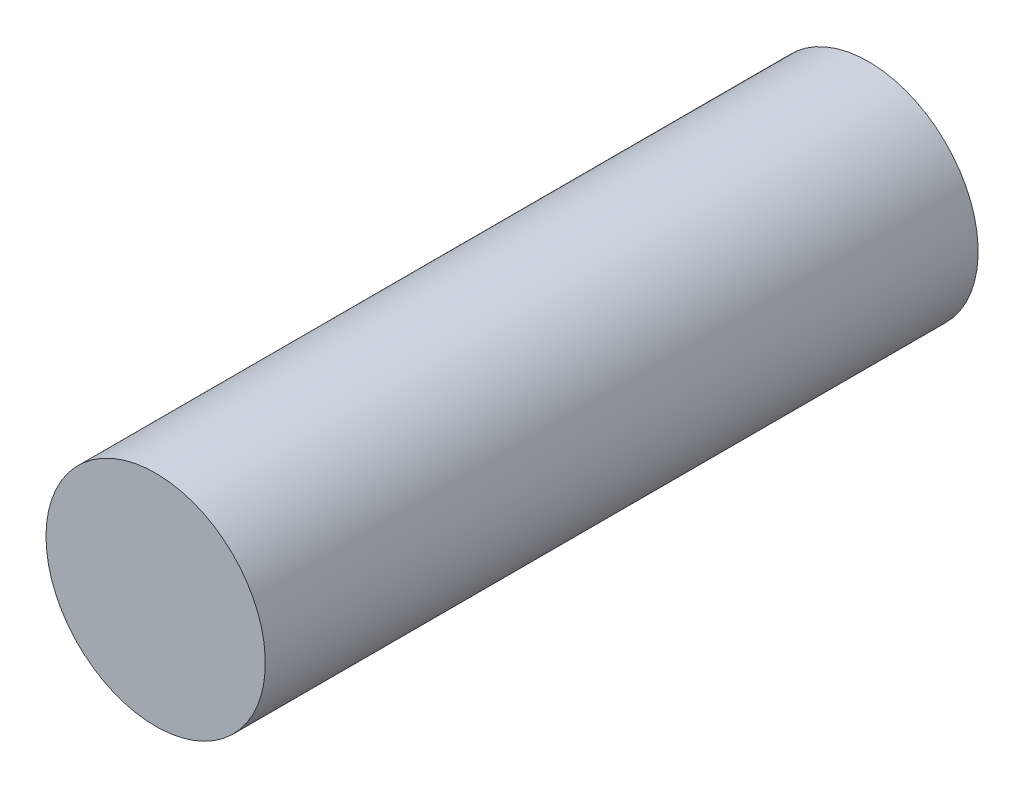
ISO-10303-21;
HEADER;
FILE_DESCRIPTION(('STEP AP214'),'2;1');
FILE_NAME('part.step','',(''),(''),'','','');
FILE_SCHEMA(('AUTOMOTIVE_DESIGN { 1 0 10303 214 1 1 1 1 }'));
ENDSEC;
DATA;
#1=APPLICATION_CONTEXT('core data for automotive mechanical design processes');
#2=APPLICATION_PROTOCOL_DEFINITION('international standard','automotive_design',2000,#1);
#3=PRODUCT_CONTEXT('',#1,'mechanical');
#4=PRODUCT('Part','Part','',(#3));
#5=PRODUCT_RELATED_PRODUCT_CATEGORY('part','',(#4));
#6=PRODUCT_DEFINITION_FORMATION('','',#4);
#7=PRODUCT_DEFINITION_CONTEXT('part definition',#1,'design');
#8=PRODUCT_DEFINITION('design','',#6,#7);
#9=PRODUCT_DEFINITION_SHAPE('','',#8);
#10=(LENGTH_UNIT() NAMED_UNIT(*) SI_UNIT(.MILLI.,.METRE.));
#11=(NAMED_UNIT(*) PLANE_ANGLE_UNIT() SI_UNIT($,.RADIAN.));
#12=(NAMED_UNIT(*) SI_UNIT($,.STERADIAN.) SOLID_ANGLE_UNIT());
#13=UNCERTAINTY_MEASURE_WITH_UNIT(LENGTH_MEASURE(1.E-05),#10,'distance_accuracy_value','');
#14=(GEOMETRIC_REPRESENTATION_CONTEXT(3) GLOBAL_UNCERTAINTY_ASSIGNED_CONTEXT((#13)) GLOBAL_UNIT_ASSIGNED_CONTEXT((#10,
#11,#12)) REPRESENTATION_CONTEXT('',''));
#15=CARTESIAN_POINT('',(0.,0.,0.));
#16=DIRECTION('',(0.,0.,1.));
#17=DIRECTION('',(1.,0.,0.));
#18=AXIS2_PLACEMENT_3D('',#15,#16,#17);
#19=CARTESIAN_POINT('',(0.,0.,13.));
#20=DIRECTION('',(0.,0.,-1.));
#21=DIRECTION('',(-1.,0.,0.));
#22=AXIS2_PLACEMENT_3D('',#19,#20,#21);
#23=CYLINDRICAL_SURFACE('',#22,2.);
#24=CARTESIAN_POINT('',(0.,0.,13.));
#25=DIRECTION('',(0.,0.,1.));
#26=DIRECTION('',(1.,0.,0.));
#27=AXIS2_PLACEMENT_3D('',#24,#25,#26);
#28=CIRCLE('',#27,2.);
#29=CARTESIAN_POINT('',(-2.,0.,13.));
#30=VERTEX_POINT('',#29);
#31=EDGE_CURVE('E10',#30,#30,#28,.T.);
#32=CARTESIAN_POINT('',(0.,0.,0.));
#33=DIRECTION('',(0.,0.,1.));
#34=DIRECTION('',(1.,0.,0.));
#35=AXIS2_PLACEMENT_3D('',#32,#33,#34);
#36=CIRCLE('',#35,2.);
#37=CARTESIAN_POINT('',(-2.,0.,0.));
#38=VERTEX_POINT('',#37);
#39=EDGE_CURVE('E33',#38,#38,#36,.T.);
#40=CARTESIAN_POINT('',(-2.,0.,13.));
#41=CARTESIAN_POINT('',(-2.,0.,12.8645833333333));
#42=CARTESIAN_POINT('',(-2.,0.,12.7291666666667));
#43=CARTESIAN_POINT('',(-2.,0.,12.4583333333333));
#44=CARTESIAN_POINT('',(-2.,0.,12.3229166666667));
#45=CARTESIAN_POINT('',(-2.,0.,12.0520833333333));
#46=CARTESIAN_POINT('',(-2.,0.,11.9166666666667));
#47=CARTESIAN_POINT('',(-2.,0.,11.6458333333333));
#48=CARTESIAN_POINT('',(-2.,0.,11.5104166666667));
#49=CARTESIAN_POINT('',(-2.,0.,11.2395833333333));
#50=CARTESIAN_POINT('',(-2.,0.,11.1041666666667));
#51=CARTESIAN_POINT('',(-2.,0.,10.8333333333333));
#52=CARTESIAN_POINT('',(-2.,0.,10.6979166666667));
#53=CARTESIAN_POINT('',(-2.,0.,10.4270833333333));
#54=CARTESIAN_POINT('',(-2.,0.,10.2916666666667));
#55=CARTESIAN_POINT('',(-2.,0.,10.0208333333333));
#56=CARTESIAN_POINT('',(-2.,0.,9.88541666666667));
#57=CARTESIAN_POINT('',(-2.,0.,9.61458333333333));
#58=CARTESIAN_POINT('',(-2.,0.,9.47916666666667));
#59=CARTESIAN_POINT('',(-2.,0.,9.20833333333333));
#60=CARTESIAN_POINT('',(-2.,0.,9.07291666666666));
#61=CARTESIAN_POINT('',(-2.,0.,8.80208333333333));
#62=CARTESIAN_POINT('',(-2.,0.,8.66666666666667));
#63=CARTESIAN_POINT('',(-2.,0.,8.39583333333333));
#64=CARTESIAN_POINT('',(-2.,0.,8.26041666666667));
#65=CARTESIAN_POINT('',(-2.,0.,7.98958333333333));
#66=CARTESIAN_POINT('',(-2.,0.,7.85416666666667));
#67=CARTESIAN_POINT('',(-2.,0.,7.58333333333333));
#68=CARTESIAN_POINT('',(-2.,0.,7.44791666666667));
#69=CARTESIAN_POINT('',(-2.,0.,7.17708333333333));
#70=CARTESIAN_POINT('',(-2.,0.,7.04166666666667));
#71=CARTESIAN_POINT('',(-2.,0.,6.77083333333333));
#72=CARTESIAN_POINT('',(-2.,0.,6.63541666666667));
#73=CARTESIAN_POINT('',(-2.,0.,6.36458333333333));
#74=CARTESIAN_POINT('',(-2.,0.,6.22916666666667));
#75=CARTESIAN_POINT('',(-2.,0.,5.95833333333333));
#76=CARTESIAN_POINT('',(-2.,0.,5.82291666666667));
#77=CARTESIAN_POINT('',(-2.,0.,5.55208333333333));
#78=CARTESIAN_POINT('',(-2.,0.,5.41666666666667));
#79=CARTESIAN_POINT('',(-2.,0.,5.14583333333333));
#80=CARTESIAN_POINT('',(-2.,0.,5.01041666666667));
#81=CARTESIAN_POINT('',(-2.,0.,4.73958333333333));
#82=CARTESIAN_POINT('',(-2.,0.,4.60416666666667));
#83=CARTESIAN_POINT('',(-2.,0.,4.33333333333333));
#84=CARTESIAN_POINT('',(-2.,0.,4.19791666666667));
#85=CARTESIAN_POINT('',(-2.,0.,3.92708333333333));
#86=CARTESIAN_POINT('',(-2.,0.,3.79166666666667));
#87=CARTESIAN_POINT('',(-2.,0.,3.52083333333333));
#88=CARTESIAN_POINT('',(-2.,0.,3.38541666666667));
#89=CARTESIAN_POINT('',(-2.,0.,3.11458333333333));
#90=CARTESIAN_POINT('',(-2.,0.,2.97916666666667));
#91=CARTESIAN_POINT('',(-2.,0.,2.70833333333333));
#92=CARTESIAN_POINT('',(-2.,0.,2.57291666666667));
#93=CARTESIAN_POINT('',(-2.,0.,2.30208333333333));
#94=CARTESIAN_POINT('',(-2.,0.,2.16666666666667));
#95=CARTESIAN_POINT('',(-2.,0.,1.89583333333333));
#96=CARTESIAN_POINT('',(-2.,0.,1.76041666666667));
#97=CARTESIAN_POINT('',(-2.,0.,1.48958333333333));
#98=CARTESIAN_POINT('',(-2.,0.,1.35416666666667));
#99=CARTESIAN_POINT('',(-2.,0.,1.08333333333333));
#100=CARTESIAN_POINT('',(-2.,0.,0.947916666666667));
#101=CARTESIAN_POINT('',(-2.,0.,0.677083333333334));
#102=CARTESIAN_POINT('',(-2.,0.,0.541666666666667));
#103=CARTESIAN_POINT('',(-2.,0.,0.270833333333334));
#104=CARTESIAN_POINT('',(-2.,0.,0.135416666666667));
#105=CARTESIAN_POINT('',(-2.,0.,0.));
#106=B_SPLINE_CURVE_WITH_KNOTS('',3,(#40,#41,#42,#43,#44,#45,#46,#47,#48,#49,#50,#51,#52,#53,
#54,#55,#56,#57,#58,#59,#60,#61,#62,#63,#64,#65,#66,#67,#68,#69,#70,#71,#72,#73,#74,#75,#76,#77,
#78,#79,#80,#81,#82,#83,#84,#85,#86,#87,#88,#89,#90,#91,#92,#93,#94,#95,#96,#97,#98,#99,#100,
#101,#102,#103,#104,#105),.UNSPECIFIED.,.F.,.F.,(4,2,2,2,2,2,2,2,2,2,2,2,2,2,2,2,2,2,2,2,2,2,2,
2,2,2,2,2,2,2,2,2,4),(0.,0.40625,0.812500000000001,1.21875,1.625,2.03125,2.4375,2.84375,3.25,
3.65625,4.0625,4.46875,4.875,5.28125,5.6875,6.09375,6.5,6.90625,7.3125,7.71875,8.125,8.53125,
8.9375,9.34375,9.75,10.15625,10.5625,10.96875,11.375,11.78125,12.1875,12.59375,13.),.UNSPECIFIED.);
#107=EDGE_CURVE('BSEAM30',#30,#38,#106,.T.);
#108=ORIENTED_EDGE('',*,*,#31,.F.);
#109=ORIENTED_EDGE('',*,*,#39,.T.);
#110=ORIENTED_EDGE('',*,*,#107,.T.);
#111=ORIENTED_EDGE('',*,*,#107,.F.);
#112=EDGE_LOOP('',(#108,#110,#109,#111));
#113=FACE_BOUND('',#112,.T.);
#114=ADVANCED_FACE('F30',(#113),#23,.T.);
#115=CARTESIAN_POINT('',(0.,0.,13.));
#116=DIRECTION('',(0.,0.,1.));
#117=DIRECTION('',(1.,0.,0.));
#118=AXIS2_PLACEMENT_3D('',#115,#116,#117);
#119=PLANE('',#118);
#120=ORIENTED_EDGE('',*,*,#31,.T.);
#121=EDGE_LOOP('',(#120));
#122=FACE_BOUND('',#121,.T.);
#123=ADVANCED_FACE('F45',(#122),#119,.T.);
#124=CARTESIAN_POINT('',(0.,0.,0.));
#125=DIRECTION('',(0.,0.,1.));
#126=DIRECTION('',(1.,0.,0.));
#127=AXIS2_PLACEMENT_3D('',#124,#125,#126);
#128=PLANE('',#127);
#129=ORIENTED_EDGE('',*,*,#39,.F.);
#130=EDGE_LOOP('',(#129));
#131=FACE_BOUND('',#130,.T.);
#132=ADVANCED_FACE('F43',(#131),#128,.F.);
#133=CLOSED_SHELL('',(#114,#123,#132));
#134=MANIFOLD_SOLID_BREP('B2',#133);
#135=ADVANCED_BREP_SHAPE_REPRESENTATION('',(#18,#134),#14);
#136=SHAPE_DEFINITION_REPRESENTATION(#9,#135);
ENDSEC;
END-ISO-10303-21;
